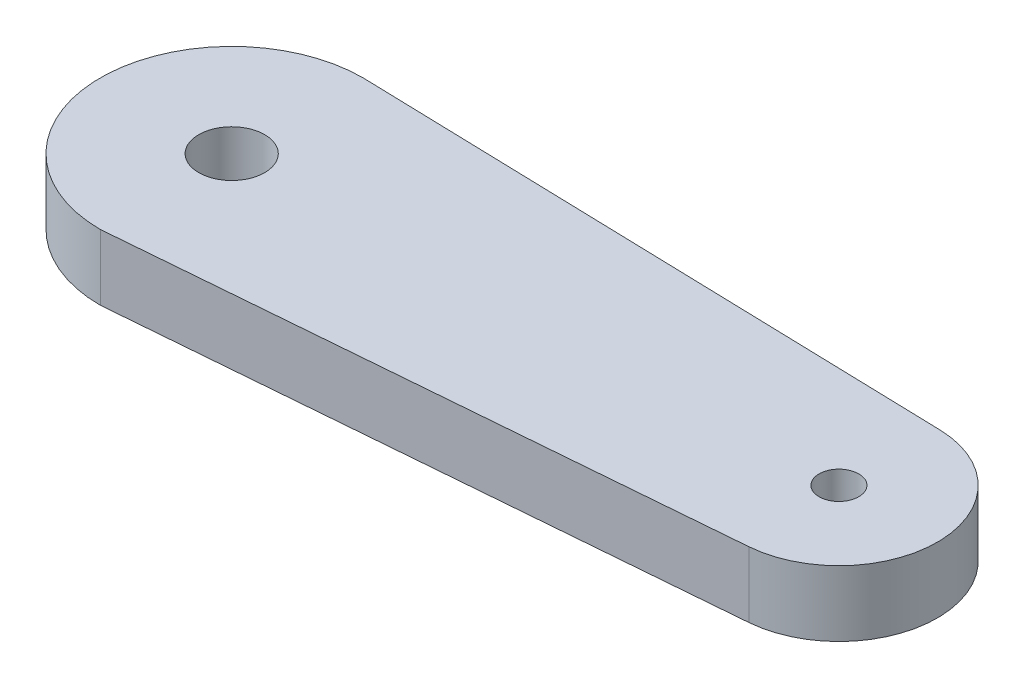
ISO-10303-21;
HEADER;
FILE_DESCRIPTION(('STEP AP214'),'2;1');
FILE_NAME('part.step','',(''),(''),'','','');
FILE_SCHEMA(('AUTOMOTIVE_DESIGN { 1 0 10303 214 1 1 1 1 }'));
ENDSEC;
DATA;
#1=APPLICATION_CONTEXT('core data for automotive mechanical design processes');
#2=APPLICATION_PROTOCOL_DEFINITION('international standard','automotive_design',2000,#1);
#3=PRODUCT_CONTEXT('',#1,'mechanical');
#4=PRODUCT('Part','Part','',(#3));
#5=PRODUCT_RELATED_PRODUCT_CATEGORY('part','',(#4));
#6=PRODUCT_DEFINITION_FORMATION('','',#4);
#7=PRODUCT_DEFINITION_CONTEXT('part definition',#1,'design');
#8=PRODUCT_DEFINITION('design','',#6,#7);
#9=PRODUCT_DEFINITION_SHAPE('','',#8);
#10=(LENGTH_UNIT() NAMED_UNIT(*) SI_UNIT(.MILLI.,.METRE.));
#11=(NAMED_UNIT(*) PLANE_ANGLE_UNIT() SI_UNIT($,.RADIAN.));
#12=(NAMED_UNIT(*) SI_UNIT($,.STERADIAN.) SOLID_ANGLE_UNIT());
#13=UNCERTAINTY_MEASURE_WITH_UNIT(LENGTH_MEASURE(1.E-05),#10,'distance_accuracy_value','');
#14=(GEOMETRIC_REPRESENTATION_CONTEXT(3) GLOBAL_UNCERTAINTY_ASSIGNED_CONTEXT((#13)) GLOBAL_UNIT_ASSIGNED_CONTEXT((#10,
#11,#12)) REPRESENTATION_CONTEXT('',''));
#15=CARTESIAN_POINT('',(0.,0.,0.));
#16=DIRECTION('',(0.,0.,1.));
#17=DIRECTION('',(1.,0.,0.));
#18=AXIS2_PLACEMENT_3D('',#15,#16,#17);
#19=CARTESIAN_POINT('',(0.821566681352623,5.,9.93204097591365));
#20=DIRECTION('',(-0.0824372634712927,0.,-0.996596256059275));
#21=DIRECTION('',(-0.996596256059275,0.,0.0824372634712927));
#22=AXIS2_PLACEMENT_3D('',#19,#20,#21);
#23=PLANE('',#22);
#24=DIRECTION('',(0.996596256059275,0.,-0.0824372634712927));
#25=VECTOR('',#24,1.);
#26=CARTESIAN_POINT('',(0.821566681352623,0.,9.93204097591365));
#27=LINE('',#26,#25);
#28=CARTESIAN_POINT('',(0.,0.,10.));
#29=VERTEX_POINT('',#28);
#30=CARTESIAN_POINT('',(45.6010112062696,0.,6.22793829245028));
#31=VERTEX_POINT('',#30);
#32=EDGE_CURVE('E101',#29,#31,#27,.T.);
#33=ORIENTED_EDGE('',*,*,#32,.T.);
#34=DIRECTION('',(0.,-1.,0.));
#35=VECTOR('',#34,1.);
#36=CARTESIAN_POINT('',(45.6010112062696,5.,6.22793829245028));
#37=LINE('',#36,#35);
#38=CARTESIAN_POINT('',(45.6010112062696,5.,6.22793829245028));
#39=VERTEX_POINT('',#38);
#40=EDGE_CURVE('E11',#39,#31,#37,.T.);
#41=ORIENTED_EDGE('',*,*,#40,.F.);
#42=DIRECTION('',(0.996596256059275,0.,-0.0824372634712927));
#43=VECTOR('',#42,1.);
#44=CARTESIAN_POINT('',(0.821566681352623,5.,9.93204097591365));
#45=LINE('',#44,#43);
#46=CARTESIAN_POINT('',(0.,5.,10.));
#47=VERTEX_POINT('',#46);
#48=EDGE_CURVE('E86',#47,#39,#45,.T.);
#49=ORIENTED_EDGE('',*,*,#48,.F.);
#50=DIRECTION('',(0.,-1.,0.));
#51=VECTOR('',#50,1.);
#52=CARTESIAN_POINT('',(0.,5.,10.));
#53=LINE('',#52,#51);
#54=EDGE_CURVE('E97',#47,#29,#53,.T.);
#55=ORIENTED_EDGE('',*,*,#54,.T.);
#56=EDGE_LOOP('',(#33,#41,#49,#55));
#57=FACE_BOUND('',#56,.T.);
#58=ADVANCED_FACE('F39',(#57),#23,.F.);
#59=CARTESIAN_POINT('',(44.9827317302349,5.,-1.24653362799429));
#60=DIRECTION('',(0.,-1.,0.));
#61=DIRECTION('',(0.,0.,-1.));
#62=AXIS2_PLACEMENT_3D('',#59,#60,#61);
#63=CYLINDRICAL_SURFACE('',#62,7.50000000000001);
#64=CARTESIAN_POINT('',(44.9827317302349,0.,-1.24653362799429));
#65=DIRECTION('',(0.,1.,0.));
#66=DIRECTION('',(0.,0.,1.));
#67=AXIS2_PLACEMENT_3D('',#64,#65,#66);
#68=CIRCLE('',#67,7.50000000000001);
#69=CARTESIAN_POINT('',(45.1911593044558,0.,-8.74363693169128));
#70=VERTEX_POINT('',#69);
#71=EDGE_CURVE('E91',#31,#70,#68,.T.);
#72=ORIENTED_EDGE('',*,*,#71,.T.);
#73=DIRECTION('',(0.,-1.,0.));
#74=VECTOR('',#73,1.);
#75=CARTESIAN_POINT('',(45.1911593044558,5.,-8.74363693169128));
#76=LINE('',#75,#74);
#77=CARTESIAN_POINT('',(45.1911593044558,5.,-8.74363693169128));
#78=VERTEX_POINT('',#77);
#79=EDGE_CURVE('E47',#78,#70,#76,.T.);
#80=ORIENTED_EDGE('',*,*,#79,.F.);
#81=CARTESIAN_POINT('',(44.9827317302349,5.,-1.24653362799429));
#82=DIRECTION('',(0.,1.,0.));
#83=DIRECTION('',(0.,0.,1.));
#84=AXIS2_PLACEMENT_3D('',#81,#82,#83);
#85=CIRCLE('',#84,7.50000000000001);
#86=EDGE_CURVE('E81',#39,#78,#85,.T.);
#87=ORIENTED_EDGE('',*,*,#86,.F.);
#88=ORIENTED_EDGE('',*,*,#40,.T.);
#89=EDGE_LOOP('',(#72,#80,#87,#88));
#90=FACE_BOUND('',#89,.T.);
#91=ADVANCED_FACE('F90',(#90),#63,.T.);
#92=CARTESIAN_POINT('',(0.277796098715276,5.,-9.99227696823189));
#93=DIRECTION('',(0.0277903432294599,0.,-0.999613773826266));
#94=DIRECTION('',(-0.999613773826266,0.,-0.0277903432294599));
#95=AXIS2_PLACEMENT_3D('',#92,#93,#94);
#96=PLANE('',#95);
#97=DIRECTION('',(0.999613773826266,0.,0.0277903432294599));
#98=VECTOR('',#97,1.);
#99=CARTESIAN_POINT('',(0.277796098715276,0.,-9.99227696823189));
#100=LINE('',#99,#98);
#101=CARTESIAN_POINT('',(0.,0.,-10.));
#102=VERTEX_POINT('',#101);
#103=EDGE_CURVE('E106',#102,#70,#100,.T.);
#104=ORIENTED_EDGE('',*,*,#103,.F.);
#105=DIRECTION('',(0.,-1.,0.));
#106=VECTOR('',#105,1.);
#107=CARTESIAN_POINT('',(0.,5.,-10.));
#108=LINE('',#107,#106);
#109=CARTESIAN_POINT('',(0.,5.,-10.));
#110=VERTEX_POINT('',#109);
#111=EDGE_CURVE('E71',#110,#102,#108,.T.);
#112=ORIENTED_EDGE('',*,*,#111,.F.);
#113=DIRECTION('',(0.999613773826266,0.,0.0277903432294599));
#114=VECTOR('',#113,1.);
#115=CARTESIAN_POINT('',(0.277796098715276,5.,-9.99227696823189));
#116=LINE('',#115,#114);
#117=EDGE_CURVE('E84',#110,#78,#116,.T.);
#118=ORIENTED_EDGE('',*,*,#117,.T.);
#119=ORIENTED_EDGE('',*,*,#79,.T.);
#120=EDGE_LOOP('',(#104,#112,#118,#119));
#121=FACE_BOUND('',#120,.T.);
#122=ADVANCED_FACE('F95',(#121),#96,.T.);
#123=CARTESIAN_POINT('',(0.,5.,0.));
#124=DIRECTION('',(0.,-1.,0.));
#125=DIRECTION('',(0.,0.,-1.));
#126=AXIS2_PLACEMENT_3D('',#123,#124,#125);
#127=CYLINDRICAL_SURFACE('',#126,10.);
#128=CARTESIAN_POINT('',(0.,0.,0.));
#129=DIRECTION('',(0.,1.,0.));
#130=DIRECTION('',(0.,0.,1.));
#131=AXIS2_PLACEMENT_3D('',#128,#129,#130);
#132=CIRCLE('',#131,10.);
#133=EDGE_CURVE('E74',#102,#29,#132,.T.);
#134=ORIENTED_EDGE('',*,*,#133,.T.);
#135=ORIENTED_EDGE('',*,*,#54,.F.);
#136=CARTESIAN_POINT('',(0.,5.,0.));
#137=DIRECTION('',(0.,1.,0.));
#138=DIRECTION('',(0.,0.,1.));
#139=AXIS2_PLACEMENT_3D('',#136,#137,#138);
#140=CIRCLE('',#139,10.);
#141=EDGE_CURVE('E55',#110,#47,#140,.T.);
#142=ORIENTED_EDGE('',*,*,#141,.F.);
#143=ORIENTED_EDGE('',*,*,#111,.T.);
#144=EDGE_LOOP('',(#134,#135,#142,#143));
#145=FACE_BOUND('',#144,.T.);
#146=ADVANCED_FACE('F125',(#145),#127,.T.);
#147=CARTESIAN_POINT('',(0.,5.,0.));
#148=DIRECTION('',(0.,1.,0.));
#149=DIRECTION('',(0.,0.,1.));
#150=AXIS2_PLACEMENT_3D('',#147,#148,#149);
#151=PLANE('',#150);
#152=CARTESIAN_POINT('',(0.,5.,0.));
#153=DIRECTION('',(0.,1.,0.));
#154=DIRECTION('',(0.,0.,1.));
#155=AXIS2_PLACEMENT_3D('',#152,#153,#154);
#156=CIRCLE('',#155,2.51);
#157=CARTESIAN_POINT('',(0.,5.,2.51));
#158=VERTEX_POINT('',#157);
#159=EDGE_CURVE('E177',#158,#158,#156,.T.);
#160=ORIENTED_EDGE('',*,*,#159,.F.);
#161=EDGE_LOOP('',(#160));
#162=FACE_BOUND('',#161,.T.);
#163=CARTESIAN_POINT('',(44.9827317302349,5.,-1.24653362799429));
#164=DIRECTION('',(0.,1.,0.));
#165=DIRECTION('',(0.,0.,1.));
#166=AXIS2_PLACEMENT_3D('',#163,#164,#165);
#167=CIRCLE('',#166,1.51);
#168=CARTESIAN_POINT('',(44.9827317302349,5.,0.263466372005712));
#169=VERTEX_POINT('',#168);
#170=EDGE_CURVE('E183',#169,#169,#167,.T.);
#171=ORIENTED_EDGE('',*,*,#170,.F.);
#172=EDGE_LOOP('',(#171));
#173=FACE_BOUND('',#172,.T.);
#174=ORIENTED_EDGE('',*,*,#48,.T.);
#175=ORIENTED_EDGE('',*,*,#86,.T.);
#176=ORIENTED_EDGE('',*,*,#117,.F.);
#177=ORIENTED_EDGE('',*,*,#141,.T.);
#178=EDGE_LOOP('',(#174,#175,#176,#177));
#179=FACE_BOUND('',#178,.T.);
#180=ADVANCED_FACE('F82',(#162,#173,#179),#151,.T.);
#181=CARTESIAN_POINT('',(0.,0.,0.));
#182=DIRECTION('',(0.,1.,0.));
#183=DIRECTION('',(0.,0.,1.));
#184=AXIS2_PLACEMENT_3D('',#181,#182,#183);
#185=PLANE('',#184);
#186=CARTESIAN_POINT('',(0.,0.,0.));
#187=DIRECTION('',(0.,1.,0.));
#188=DIRECTION('',(0.,0.,1.));
#189=AXIS2_PLACEMENT_3D('',#186,#187,#188);
#190=CIRCLE('',#189,2.51);
#191=CARTESIAN_POINT('',(0.,0.,2.51));
#192=VERTEX_POINT('',#191);
#193=EDGE_CURVE('E104',#192,#192,#190,.F.);
#194=ORIENTED_EDGE('',*,*,#193,.F.);
#195=EDGE_LOOP('',(#194));
#196=FACE_BOUND('',#195,.T.);
#197=CARTESIAN_POINT('',(44.9827317302349,0.,-1.24653362799429));
#198=DIRECTION('',(0.,1.,0.));
#199=DIRECTION('',(0.,0.,1.));
#200=AXIS2_PLACEMENT_3D('',#197,#198,#199);
#201=CIRCLE('',#200,1.51);
#202=CARTESIAN_POINT('',(44.9827317302349,0.,0.263466372005712));
#203=VERTEX_POINT('',#202);
#204=EDGE_CURVE('E180',#203,#203,#201,.F.);
#205=ORIENTED_EDGE('',*,*,#204,.F.);
#206=EDGE_LOOP('',(#205));
#207=FACE_BOUND('',#206,.T.);
#208=ORIENTED_EDGE('',*,*,#32,.F.);
#209=ORIENTED_EDGE('',*,*,#133,.F.);
#210=ORIENTED_EDGE('',*,*,#103,.T.);
#211=ORIENTED_EDGE('',*,*,#71,.F.);
#212=EDGE_LOOP('',(#208,#209,#210,#211));
#213=FACE_BOUND('',#212,.T.);
#214=ADVANCED_FACE('F113',(#196,#207,#213),#185,.F.);
#215=CARTESIAN_POINT('',(44.9827317302349,-0.00100000000000013,-1.24653362799429));
#216=DIRECTION('',(0.,1.,0.));
#217=DIRECTION('',(0.,0.,1.));
#218=AXIS2_PLACEMENT_3D('',#215,#216,#217);
#219=CYLINDRICAL_SURFACE('',#218,1.51);
#220=ORIENTED_EDGE('',*,*,#170,.T.);
#221=EDGE_LOOP('',(#220));
#222=FACE_BOUND('',#221,.T.);
#223=ORIENTED_EDGE('',*,*,#204,.T.);
#224=EDGE_LOOP('',(#223));
#225=FACE_BOUND('',#224,.T.);
#226=ADVANCED_FACE('F115',(#222,#225),#219,.F.);
#227=CARTESIAN_POINT('',(0.,-0.00100000000000013,0.));
#228=DIRECTION('',(0.,1.,0.));
#229=DIRECTION('',(0.,0.,1.));
#230=AXIS2_PLACEMENT_3D('',#227,#228,#229);
#231=CYLINDRICAL_SURFACE('',#230,2.51);
#232=ORIENTED_EDGE('',*,*,#159,.T.);
#233=EDGE_LOOP('',(#232));
#234=FACE_BOUND('',#233,.T.);
#235=ORIENTED_EDGE('',*,*,#193,.T.);
#236=EDGE_LOOP('',(#235));
#237=FACE_BOUND('',#236,.T.);
#238=ADVANCED_FACE('F122',(#234,#237),#231,.F.);
#239=CLOSED_SHELL('',(#58,#91,#122,#146,#180,#214,#226,#238));
#240=MANIFOLD_SOLID_BREP('B2',#239);
#241=ADVANCED_BREP_SHAPE_REPRESENTATION('',(#18,#240),#14);
#242=SHAPE_DEFINITION_REPRESENTATION(#9,#241);
ENDSEC;
END-ISO-10303-21;
